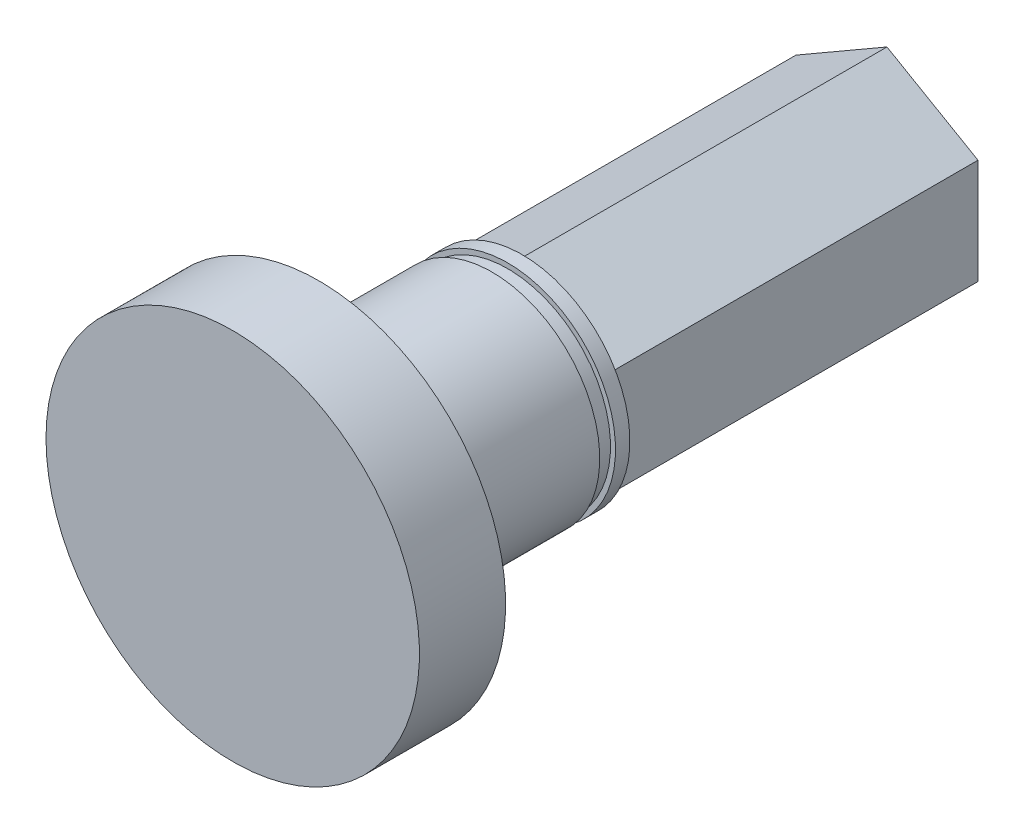
ISO-10303-21;
HEADER;
FILE_DESCRIPTION(('STEP AP214'),'2;1');
FILE_NAME('part.step','',(''),(''),'','','');
FILE_SCHEMA(('AUTOMOTIVE_DESIGN { 1 0 10303 214 1 1 1 1 }'));
ENDSEC;
DATA;
#1=APPLICATION_CONTEXT('core data for automotive mechanical design processes');
#2=APPLICATION_PROTOCOL_DEFINITION('international standard','automotive_design',2000,#1);
#3=PRODUCT_CONTEXT('',#1,'mechanical');
#4=PRODUCT('Part','Part','',(#3));
#5=PRODUCT_RELATED_PRODUCT_CATEGORY('part','',(#4));
#6=PRODUCT_DEFINITION_FORMATION('','',#4);
#7=PRODUCT_DEFINITION_CONTEXT('part definition',#1,'design');
#8=PRODUCT_DEFINITION('design','',#6,#7);
#9=PRODUCT_DEFINITION_SHAPE('','',#8);
#10=(LENGTH_UNIT() NAMED_UNIT(*) SI_UNIT(.MILLI.,.METRE.));
#11=(NAMED_UNIT(*) PLANE_ANGLE_UNIT() SI_UNIT($,.RADIAN.));
#12=(NAMED_UNIT(*) SI_UNIT($,.STERADIAN.) SOLID_ANGLE_UNIT());
#13=UNCERTAINTY_MEASURE_WITH_UNIT(LENGTH_MEASURE(1.E-05),#10,'distance_accuracy_value','');
#14=(GEOMETRIC_REPRESENTATION_CONTEXT(3) GLOBAL_UNCERTAINTY_ASSIGNED_CONTEXT((#13)) GLOBAL_UNIT_ASSIGNED_CONTEXT((#10,
#11,#12)) REPRESENTATION_CONTEXT('',''));
#15=CARTESIAN_POINT('',(0.,0.,0.));
#16=DIRECTION('',(0.,0.,1.));
#17=DIRECTION('',(1.,0.,0.));
#18=AXIS2_PLACEMENT_3D('',#15,#16,#17);
#19=CARTESIAN_POINT('',(0.,0.,16.6624000000866));
#20=DIRECTION('',(0.,0.,-1.));
#21=DIRECTION('',(-1.,0.,0.));
#22=AXIS2_PLACEMENT_3D('',#19,#20,#21);
#23=CONICAL_SURFACE('',#22,2.0192999998585,1.0297442585643);
#24=CARTESIAN_POINT('',(-1.13686837721616E-10,0.,17.8757178480282));
#25=VERTEX_POINT('',#24);
#26=VERTEX_LOOP('',#25);
#27=FACE_BOUND('',#26,.T.);
#28=CARTESIAN_POINT('',(0.,0.,16.6624));
#29=DIRECTION('',(0.,0.,-1.));
#30=DIRECTION('',(-1.,0.,0.));
#31=AXIS2_PLACEMENT_3D('',#28,#29,#30);
#32=CIRCLE('',#31,2.01929999999999);
#33=CARTESIAN_POINT('',(-2.01929999999999,0.,16.6624));
#34=VERTEX_POINT('',#33);
#35=EDGE_CURVE('E78',#34,#34,#32,.T.);
#36=ORIENTED_EDGE('',*,*,#35,.T.);
#37=EDGE_LOOP('',(#36));
#38=FACE_BOUND('',#37,.T.);
#39=ADVANCED_FACE('F16',(#27,#38),#23,.F.);
#40=CARTESIAN_POINT('',(0.,0.,0.));
#41=DIRECTION('',(0.,0.,-1.));
#42=DIRECTION('',(-1.,0.,0.));
#43=AXIS2_PLACEMENT_3D('',#40,#41,#42);
#44=CYLINDRICAL_SURFACE('',#43,2.01929999999999);
#45=ORIENTED_EDGE('',*,*,#35,.F.);
#46=EDGE_LOOP('',(#45));
#47=FACE_BOUND('',#46,.T.);
#48=CARTESIAN_POINT('',(0.,0.,0.));
#49=DIRECTION('',(0.,0.,-1.));
#50=DIRECTION('',(-1.,0.,0.));
#51=AXIS2_PLACEMENT_3D('',#48,#49,#50);
#52=CIRCLE('',#51,2.01929999999999);
#53=CARTESIAN_POINT('',(-2.01929999999999,0.,0.));
#54=VERTEX_POINT('',#53);
#55=EDGE_CURVE('E19',#54,#54,#52,.T.);
#56=ORIENTED_EDGE('',*,*,#55,.T.);
#57=EDGE_LOOP('',(#56));
#58=FACE_BOUND('',#57,.T.);
#59=ADVANCED_FACE('F75',(#47,#58),#44,.F.);
#60=CARTESIAN_POINT('',(0.,0.,0.));
#61=DIRECTION('',(0.,0.,1.));
#62=DIRECTION('',(1.,0.,0.));
#63=AXIS2_PLACEMENT_3D('',#60,#61,#62);
#64=PLANE('',#63);
#65=DIRECTION('',(-0.866025403784439,-0.5,0.));
#66=VECTOR('',#65,1.);
#67=CARTESIAN_POINT('',(0.,-7.31768372187083,0.));
#68=LINE('',#67,#66);
#69=CARTESIAN_POINT('',(6.3373,-3.65884186093542,0.));
#70=VERTEX_POINT('',#69);
#71=CARTESIAN_POINT('',(0.,-7.31768372187083,0.));
#72=VERTEX_POINT('',#71);
#73=EDGE_CURVE('E134',#70,#72,#68,.T.);
#74=ORIENTED_EDGE('',*,*,#73,.T.);
#75=DIRECTION('',(-0.866025403784439,0.5,0.));
#76=VECTOR('',#75,1.);
#77=CARTESIAN_POINT('',(-6.3373,-3.65884186093542,0.));
#78=LINE('',#77,#76);
#79=CARTESIAN_POINT('',(-6.3373,-3.65884186093542,0.));
#80=VERTEX_POINT('',#79);
#81=EDGE_CURVE('E69',#72,#80,#78,.T.);
#82=ORIENTED_EDGE('',*,*,#81,.T.);
#83=DIRECTION('',(0.,1.,0.));
#84=VECTOR('',#83,1.);
#85=CARTESIAN_POINT('',(-6.3373,3.65884186093542,0.));
#86=LINE('',#85,#84);
#87=CARTESIAN_POINT('',(-6.3373,3.65884186093541,0.));
#88=VERTEX_POINT('',#87);
#89=EDGE_CURVE('E155',#80,#88,#86,.T.);
#90=ORIENTED_EDGE('',*,*,#89,.T.);
#91=DIRECTION('',(0.866025403784439,0.5,0.));
#92=VECTOR('',#91,1.);
#93=CARTESIAN_POINT('',(0.,7.31768372187083,0.));
#94=LINE('',#93,#92);
#95=CARTESIAN_POINT('',(0.,7.31768372187083,0.));
#96=VERTEX_POINT('',#95);
#97=EDGE_CURVE('E150',#88,#96,#94,.T.);
#98=ORIENTED_EDGE('',*,*,#97,.T.);
#99=DIRECTION('',(0.866025403784439,-0.5,0.));
#100=VECTOR('',#99,1.);
#101=CARTESIAN_POINT('',(6.3373,3.65884186093542,0.));
#102=LINE('',#101,#100);
#103=CARTESIAN_POINT('',(6.3373,3.65884186093542,0.));
#104=VERTEX_POINT('',#103);
#105=EDGE_CURVE('E145',#96,#104,#102,.T.);
#106=ORIENTED_EDGE('',*,*,#105,.T.);
#107=DIRECTION('',(0.,1.,0.));
#108=VECTOR('',#107,1.);
#109=CARTESIAN_POINT('',(6.3373,-3.65884186093542,0.));
#110=LINE('',#109,#108);
#111=EDGE_CURVE('E140',#104,#70,#110,.F.);
#112=ORIENTED_EDGE('',*,*,#111,.T.);
#113=EDGE_LOOP('',(#74,#82,#90,#98,#106,#112));
#114=FACE_BOUND('',#113,.T.);
#115=ORIENTED_EDGE('',*,*,#55,.F.);
#116=EDGE_LOOP('',(#115));
#117=FACE_BOUND('',#116,.T.);
#118=ADVANCED_FACE('F166',(#114,#117),#64,.F.);
#119=CARTESIAN_POINT('',(-6.3373,-3.65884186093542,25.4));
#120=DIRECTION('',(0.5,0.866025403784439,0.));
#121=DIRECTION('',(-0.866025403784439,0.5,0.));
#122=AXIS2_PLACEMENT_3D('',#119,#120,#121);
#123=PLANE('',#122);
#124=DIRECTION('',(0.,0.,1.));
#125=VECTOR('',#124,1.);
#126=CARTESIAN_POINT('',(0.,-7.31768372187083,25.4));
#127=LINE('',#126,#125);
#128=CARTESIAN_POINT('',(0.,-7.31768372187083,25.4));
#129=VERTEX_POINT('',#128);
#130=EDGE_CURVE('E138',#72,#129,#127,.T.);
#131=ORIENTED_EDGE('',*,*,#130,.T.);
#132=DIRECTION('',(-0.866025403784439,0.5,0.));
#133=VECTOR('',#132,1.);
#134=CARTESIAN_POINT('',(0.,-7.31768372187083,25.4));
#135=LINE('',#134,#133);
#136=CARTESIAN_POINT('',(-6.3373,-3.65884186093542,25.4));
#137=VERTEX_POINT('',#136);
#138=EDGE_CURVE('E132',#129,#137,#135,.T.);
#139=ORIENTED_EDGE('',*,*,#138,.T.);
#140=DIRECTION('',(0.,0.,1.));
#141=VECTOR('',#140,1.);
#142=CARTESIAN_POINT('',(-6.3373,-3.65884186093542,25.4));
#143=LINE('',#142,#141);
#144=EDGE_CURVE('E156',#137,#80,#143,.F.);
#145=ORIENTED_EDGE('',*,*,#144,.T.);
#146=ORIENTED_EDGE('',*,*,#81,.F.);
#147=EDGE_LOOP('',(#131,#139,#145,#146));
#148=FACE_BOUND('',#147,.T.);
#149=ADVANCED_FACE('F160',(#148),#123,.F.);
#150=CARTESIAN_POINT('',(-6.3373,3.65884186093542,25.4));
#151=DIRECTION('',(1.,0.,0.));
#152=DIRECTION('',(0.,1.,0.));
#153=AXIS2_PLACEMENT_3D('',#150,#151,#152);
#154=PLANE('',#153);
#155=ORIENTED_EDGE('',*,*,#144,.F.);
#156=DIRECTION('',(0.,1.,0.));
#157=VECTOR('',#156,1.);
#158=CARTESIAN_POINT('',(-6.3373,0.,25.4));
#159=LINE('',#158,#157);
#160=CARTESIAN_POINT('',(-6.3373,3.65884186093542,25.4));
#161=VERTEX_POINT('',#160);
#162=EDGE_CURVE('E130',#137,#161,#159,.T.);
#163=ORIENTED_EDGE('',*,*,#162,.T.);
#164=DIRECTION('',(0.,0.,1.));
#165=VECTOR('',#164,1.);
#166=CARTESIAN_POINT('',(-6.3373,3.65884186093541,25.4));
#167=LINE('',#166,#165);
#168=EDGE_CURVE('E152',#161,#88,#167,.F.);
#169=ORIENTED_EDGE('',*,*,#168,.T.);
#170=ORIENTED_EDGE('',*,*,#89,.F.);
#171=EDGE_LOOP('',(#155,#163,#169,#170));
#172=FACE_BOUND('',#171,.T.);
#173=ADVANCED_FACE('F163',(#172),#154,.F.);
#174=CARTESIAN_POINT('',(0.,7.31768372187083,25.4));
#175=DIRECTION('',(0.5,-0.866025403784439,0.));
#176=DIRECTION('',(0.866025403784439,0.5,0.));
#177=AXIS2_PLACEMENT_3D('',#174,#175,#176);
#178=PLANE('',#177);
#179=ORIENTED_EDGE('',*,*,#168,.F.);
#180=DIRECTION('',(0.866025403784438,0.5,0.));
#181=VECTOR('',#180,1.);
#182=CARTESIAN_POINT('',(-6.3373,3.65884186093542,25.4));
#183=LINE('',#182,#181);
#184=CARTESIAN_POINT('',(0.,7.31768372187083,25.4));
#185=VERTEX_POINT('',#184);
#186=EDGE_CURVE('E128',#161,#185,#183,.T.);
#187=ORIENTED_EDGE('',*,*,#186,.T.);
#188=DIRECTION('',(0.,0.,1.));
#189=VECTOR('',#188,1.);
#190=CARTESIAN_POINT('',(0.,7.31768372187083,25.4));
#191=LINE('',#190,#189);
#192=EDGE_CURVE('E147',#185,#96,#191,.F.);
#193=ORIENTED_EDGE('',*,*,#192,.T.);
#194=ORIENTED_EDGE('',*,*,#97,.F.);
#195=EDGE_LOOP('',(#179,#187,#193,#194));
#196=FACE_BOUND('',#195,.T.);
#197=ADVANCED_FACE('F171',(#196),#178,.F.);
#198=CARTESIAN_POINT('',(6.3373,3.65884186093542,25.4));
#199=DIRECTION('',(-0.5,-0.866025403784439,0.));
#200=DIRECTION('',(0.866025403784439,-0.5,0.));
#201=AXIS2_PLACEMENT_3D('',#198,#199,#200);
#202=PLANE('',#201);
#203=ORIENTED_EDGE('',*,*,#192,.F.);
#204=DIRECTION('',(0.866025403784438,-0.5,0.));
#205=VECTOR('',#204,1.);
#206=CARTESIAN_POINT('',(0.,7.31768372187083,25.4));
#207=LINE('',#206,#205);
#208=CARTESIAN_POINT('',(6.3373,3.65884186093542,25.4));
#209=VERTEX_POINT('',#208);
#210=EDGE_CURVE('E124',#185,#209,#207,.T.);
#211=ORIENTED_EDGE('',*,*,#210,.T.);
#212=DIRECTION('',(0.,0.,1.));
#213=VECTOR('',#212,1.);
#214=CARTESIAN_POINT('',(6.3373,3.65884186093542,25.4));
#215=LINE('',#214,#213);
#216=EDGE_CURVE('E142',#209,#104,#215,.F.);
#217=ORIENTED_EDGE('',*,*,#216,.T.);
#218=ORIENTED_EDGE('',*,*,#105,.F.);
#219=EDGE_LOOP('',(#203,#211,#217,#218));
#220=FACE_BOUND('',#219,.T.);
#221=ADVANCED_FACE('F175',(#220),#202,.F.);
#222=CARTESIAN_POINT('',(6.3373,-3.65884186093542,25.4));
#223=DIRECTION('',(-1.,0.,0.));
#224=DIRECTION('',(0.,0.,1.));
#225=AXIS2_PLACEMENT_3D('',#222,#223,#224);
#226=PLANE('',#225);
#227=ORIENTED_EDGE('',*,*,#216,.F.);
#228=DIRECTION('',(0.,1.,0.));
#229=VECTOR('',#228,1.);
#230=CARTESIAN_POINT('',(6.3373,0.,25.4));
#231=LINE('',#230,#229);
#232=CARTESIAN_POINT('',(6.3373,-3.65884186093542,25.4));
#233=VERTEX_POINT('',#232);
#234=EDGE_CURVE('E34',#209,#233,#231,.F.);
#235=ORIENTED_EDGE('',*,*,#234,.T.);
#236=DIRECTION('',(0.,0.,1.));
#237=VECTOR('',#236,1.);
#238=CARTESIAN_POINT('',(6.3373,-3.65884186093542,25.4));
#239=LINE('',#238,#237);
#240=EDGE_CURVE('E136',#233,#70,#239,.F.);
#241=ORIENTED_EDGE('',*,*,#240,.T.);
#242=ORIENTED_EDGE('',*,*,#111,.F.);
#243=EDGE_LOOP('',(#227,#235,#241,#242));
#244=FACE_BOUND('',#243,.T.);
#245=ADVANCED_FACE('F177',(#244),#226,.F.);
#246=CARTESIAN_POINT('',(0.,-7.31768372187083,25.4));
#247=DIRECTION('',(-0.5,0.866025403784439,0.));
#248=DIRECTION('',(-0.866025403784439,-0.5,0.));
#249=AXIS2_PLACEMENT_3D('',#246,#247,#248);
#250=PLANE('',#249);
#251=ORIENTED_EDGE('',*,*,#240,.F.);
#252=DIRECTION('',(-0.866025403784439,-0.5,0.));
#253=VECTOR('',#252,1.);
#254=CARTESIAN_POINT('',(6.3373,-3.65884186093542,25.4));
#255=LINE('',#254,#253);
#256=EDGE_CURVE('E115',#233,#129,#255,.T.);
#257=ORIENTED_EDGE('',*,*,#256,.T.);
#258=ORIENTED_EDGE('',*,*,#130,.F.);
#259=ORIENTED_EDGE('',*,*,#73,.F.);
#260=EDGE_LOOP('',(#251,#257,#258,#259));
#261=FACE_BOUND('',#260,.T.);
#262=ADVANCED_FACE('F179',(#261),#250,.F.);
#263=CARTESIAN_POINT('',(0.,0.,25.4));
#264=DIRECTION('',(0.,0.,1.));
#265=DIRECTION('',(1.,0.,0.));
#266=AXIS2_PLACEMENT_3D('',#263,#264,#265);
#267=PLANE('',#266);
#268=ORIENTED_EDGE('',*,*,#234,.F.);
#269=ORIENTED_EDGE('',*,*,#210,.F.);
#270=ORIENTED_EDGE('',*,*,#186,.F.);
#271=ORIENTED_EDGE('',*,*,#162,.F.);
#272=ORIENTED_EDGE('',*,*,#138,.F.);
#273=ORIENTED_EDGE('',*,*,#256,.F.);
#274=EDGE_LOOP('',(#268,#269,#270,#271,#272,#273));
#275=FACE_BOUND('',#274,.T.);
#276=CARTESIAN_POINT('',(0.,0.,25.4));
#277=DIRECTION('',(0.,0.,-1.));
#278=DIRECTION('',(-1.,0.,0.));
#279=AXIS2_PLACEMENT_3D('',#276,#277,#278);
#280=CIRCLE('',#279,7.5);
#281=CARTESIAN_POINT('',(-7.5,0.,25.4));
#282=VERTEX_POINT('',#281);
#283=EDGE_CURVE('E113',#282,#282,#280,.F.);
#284=ORIENTED_EDGE('',*,*,#283,.F.);
#285=EDGE_LOOP('',(#284));
#286=FACE_BOUND('',#285,.T.);
#287=ADVANCED_FACE('F181',(#275,#286),#267,.F.);
#288=CARTESIAN_POINT('',(0.,0.,26.4));
#289=DIRECTION('',(0.,0.,-1.));
#290=DIRECTION('',(-1.,0.,0.));
#291=AXIS2_PLACEMENT_3D('',#288,#289,#290);
#292=CYLINDRICAL_SURFACE('',#291,7.5);
#293=ORIENTED_EDGE('',*,*,#283,.T.);
#294=EDGE_LOOP('',(#293));
#295=FACE_BOUND('',#294,.T.);
#296=CARTESIAN_POINT('',(0.,0.,26.4));
#297=DIRECTION('',(0.,0.,-1.));
#298=DIRECTION('',(-1.,0.,0.));
#299=AXIS2_PLACEMENT_3D('',#296,#297,#298);
#300=CIRCLE('',#299,7.5);
#301=CARTESIAN_POINT('',(-7.5,0.,26.4));
#302=VERTEX_POINT('',#301);
#303=EDGE_CURVE('E111',#302,#302,#300,.F.);
#304=ORIENTED_EDGE('',*,*,#303,.F.);
#305=EDGE_LOOP('',(#304));
#306=FACE_BOUND('',#305,.T.);
#307=ADVANCED_FACE('F188',(#295,#306),#292,.T.);
#308=CARTESIAN_POINT('',(0.,0.,26.4));
#309=DIRECTION('',(0.,0.,1.));
#310=DIRECTION('',(1.,0.,0.));
#311=AXIS2_PLACEMENT_3D('',#308,#309,#310);
#312=PLANE('',#311);
#313=ORIENTED_EDGE('',*,*,#303,.T.);
#314=EDGE_LOOP('',(#313));
#315=FACE_BOUND('',#314,.T.);
#316=CARTESIAN_POINT('',(0.,0.,26.4));
#317=DIRECTION('',(0.,0.,-1.));
#318=DIRECTION('',(-1.,0.,0.));
#319=AXIS2_PLACEMENT_3D('',#316,#317,#318);
#320=CIRCLE('',#319,7.15);
#321=CARTESIAN_POINT('',(-7.15,0.,26.4));
#322=VERTEX_POINT('',#321);
#323=EDGE_CURVE('E108',#322,#322,#320,.F.);
#324=ORIENTED_EDGE('',*,*,#323,.F.);
#325=EDGE_LOOP('',(#324));
#326=FACE_BOUND('',#325,.T.);
#327=ADVANCED_FACE('F234',(#315,#326),#312,.T.);
#328=CARTESIAN_POINT('',(0.,0.,27.5));
#329=DIRECTION('',(0.,0.,-1.));
#330=DIRECTION('',(-1.,0.,0.));
#331=AXIS2_PLACEMENT_3D('',#328,#329,#330);
#332=CYLINDRICAL_SURFACE('',#331,7.15);
#333=CARTESIAN_POINT('',(0.,0.,27.5));
#334=DIRECTION('',(0.,0.,-1.));
#335=DIRECTION('',(-1.,0.,0.));
#336=AXIS2_PLACEMENT_3D('',#333,#334,#335);
#337=CIRCLE('',#336,7.15);
#338=CARTESIAN_POINT('',(-7.15,0.,27.5));
#339=VERTEX_POINT('',#338);
#340=EDGE_CURVE('E105',#339,#339,#337,.T.);
#341=ORIENTED_EDGE('',*,*,#340,.T.);
#342=EDGE_LOOP('',(#341));
#343=FACE_BOUND('',#342,.T.);
#344=ORIENTED_EDGE('',*,*,#323,.T.);
#345=EDGE_LOOP('',(#344));
#346=FACE_BOUND('',#345,.T.);
#347=ADVANCED_FACE('F230',(#343,#346),#332,.T.);
#348=CARTESIAN_POINT('',(0.,0.,27.5));
#349=DIRECTION('',(0.,0.,1.));
#350=DIRECTION('',(1.,0.,0.));
#351=AXIS2_PLACEMENT_3D('',#348,#349,#350);
#352=PLANE('',#351);
#353=CARTESIAN_POINT('',(0.,0.,27.5));
#354=DIRECTION('',(0.,0.,-1.));
#355=DIRECTION('',(-1.,0.,0.));
#356=AXIS2_PLACEMENT_3D('',#353,#354,#355);
#357=CIRCLE('',#356,7.5);
#358=CARTESIAN_POINT('',(-7.5,0.,27.5));
#359=VERTEX_POINT('',#358);
#360=EDGE_CURVE('E102',#359,#359,#357,.F.);
#361=ORIENTED_EDGE('',*,*,#360,.F.);
#362=EDGE_LOOP('',(#361));
#363=FACE_BOUND('',#362,.T.);
#364=ORIENTED_EDGE('',*,*,#340,.F.);
#365=EDGE_LOOP('',(#364));
#366=FACE_BOUND('',#365,.T.);
#367=ADVANCED_FACE('F226',(#363,#366),#352,.F.);
#368=CARTESIAN_POINT('',(0.,0.,38.549));
#369=DIRECTION('',(0.,0.,-1.));
#370=DIRECTION('',(-1.,0.,0.));
#371=AXIS2_PLACEMENT_3D('',#368,#369,#370);
#372=CYLINDRICAL_SURFACE('',#371,7.5);
#373=ORIENTED_EDGE('',*,*,#360,.T.);
#374=EDGE_LOOP('',(#373));
#375=FACE_BOUND('',#374,.T.);
#376=CARTESIAN_POINT('',(0.,0.,38.549));
#377=DIRECTION('',(0.,0.,-1.));
#378=DIRECTION('',(-1.,0.,0.));
#379=AXIS2_PLACEMENT_3D('',#376,#377,#378);
#380=CIRCLE('',#379,7.5);
#381=CARTESIAN_POINT('',(-7.5,0.,38.549));
#382=VERTEX_POINT('',#381);
#383=EDGE_CURVE('E99',#382,#382,#380,.F.);
#384=ORIENTED_EDGE('',*,*,#383,.F.);
#385=EDGE_LOOP('',(#384));
#386=FACE_BOUND('',#385,.T.);
#387=ADVANCED_FACE('F222',(#375,#386),#372,.T.);
#388=CARTESIAN_POINT('',(0.,0.,38.549));
#389=DIRECTION('',(0.,0.,1.));
#390=DIRECTION('',(1.,0.,0.));
#391=AXIS2_PLACEMENT_3D('',#388,#389,#390);
#392=PLANE('',#391);
#393=ORIENTED_EDGE('',*,*,#383,.T.);
#394=EDGE_LOOP('',(#393));
#395=FACE_BOUND('',#394,.T.);
#396=CARTESIAN_POINT('',(0.,0.,38.549));
#397=DIRECTION('',(0.,0.,-1.));
#398=DIRECTION('',(-1.,0.,0.));
#399=AXIS2_PLACEMENT_3D('',#396,#397,#398);
#400=CIRCLE('',#399,7.15);
#401=CARTESIAN_POINT('',(-7.15,0.,38.549));
#402=VERTEX_POINT('',#401);
#403=EDGE_CURVE('E96',#402,#402,#400,.F.);
#404=ORIENTED_EDGE('',*,*,#403,.F.);
#405=EDGE_LOOP('',(#404));
#406=FACE_BOUND('',#405,.T.);
#407=ADVANCED_FACE('F218',(#395,#406),#392,.T.);
#408=CARTESIAN_POINT('',(0.,0.,39.299));
#409=DIRECTION('',(0.,0.,-1.));
#410=DIRECTION('',(-1.,0.,0.));
#411=AXIS2_PLACEMENT_3D('',#408,#409,#410);
#412=CYLINDRICAL_SURFACE('',#411,7.15);
#413=CARTESIAN_POINT('',(0.,0.,39.299));
#414=DIRECTION('',(0.,0.,-1.));
#415=DIRECTION('',(-1.,0.,0.));
#416=AXIS2_PLACEMENT_3D('',#413,#414,#415);
#417=CIRCLE('',#416,7.15);
#418=CARTESIAN_POINT('',(-7.15,0.,39.299));
#419=VERTEX_POINT('',#418);
#420=EDGE_CURVE('E93',#419,#419,#417,.T.);
#421=ORIENTED_EDGE('',*,*,#420,.T.);
#422=EDGE_LOOP('',(#421));
#423=FACE_BOUND('',#422,.T.);
#424=ORIENTED_EDGE('',*,*,#403,.T.);
#425=EDGE_LOOP('',(#424));
#426=FACE_BOUND('',#425,.T.);
#427=ADVANCED_FACE('F214',(#423,#426),#412,.T.);
#428=CARTESIAN_POINT('',(0.,0.,39.299));
#429=DIRECTION('',(0.,0.,1.));
#430=DIRECTION('',(1.,0.,0.));
#431=AXIS2_PLACEMENT_3D('',#428,#429,#430);
#432=PLANE('',#431);
#433=CARTESIAN_POINT('',(0.,0.,39.299));
#434=DIRECTION('',(0.,0.,-1.));
#435=DIRECTION('',(-1.,0.,0.));
#436=AXIS2_PLACEMENT_3D('',#433,#434,#435);
#437=CIRCLE('',#436,9.525);
#438=CARTESIAN_POINT('',(-9.525,0.,39.299));
#439=VERTEX_POINT('',#438);
#440=EDGE_CURVE('E90',#439,#439,#437,.F.);
#441=ORIENTED_EDGE('',*,*,#440,.F.);
#442=EDGE_LOOP('',(#441));
#443=FACE_BOUND('',#442,.T.);
#444=ORIENTED_EDGE('',*,*,#420,.F.);
#445=EDGE_LOOP('',(#444));
#446=FACE_BOUND('',#445,.T.);
#447=ADVANCED_FACE('F210',(#443,#446),#432,.F.);
#448=CARTESIAN_POINT('',(0.,0.,39.553));
#449=DIRECTION('',(0.,0.,-1.));
#450=DIRECTION('',(-1.,0.,0.));
#451=AXIS2_PLACEMENT_3D('',#448,#449,#450);
#452=CYLINDRICAL_SURFACE('',#451,9.525);
#453=CARTESIAN_POINT('',(0.,0.,39.553));
#454=DIRECTION('',(0.,0.,-1.));
#455=DIRECTION('',(-1.,0.,0.));
#456=AXIS2_PLACEMENT_3D('',#453,#454,#455);
#457=CIRCLE('',#456,9.525);
#458=CARTESIAN_POINT('',(-9.525,0.,39.553));
#459=VERTEX_POINT('',#458);
#460=EDGE_CURVE('E87',#459,#459,#457,.T.);
#461=ORIENTED_EDGE('',*,*,#460,.T.);
#462=EDGE_LOOP('',(#461));
#463=FACE_BOUND('',#462,.T.);
#464=ORIENTED_EDGE('',*,*,#440,.T.);
#465=EDGE_LOOP('',(#464));
#466=FACE_BOUND('',#465,.T.);
#467=ADVANCED_FACE('F206',(#463,#466),#452,.T.);
#468=CARTESIAN_POINT('',(0.,0.,39.553));
#469=DIRECTION('',(0.,0.,1.));
#470=DIRECTION('',(1.,0.,0.));
#471=AXIS2_PLACEMENT_3D('',#468,#469,#470);
#472=PLANE('',#471);
#473=CARTESIAN_POINT('',(0.,0.,39.553));
#474=DIRECTION('',(0.,0.,-1.));
#475=DIRECTION('',(-1.,0.,0.));
#476=AXIS2_PLACEMENT_3D('',#473,#474,#475);
#477=CIRCLE('',#476,13.);
#478=CARTESIAN_POINT('',(-13.,0.,39.553));
#479=VERTEX_POINT('',#478);
#480=EDGE_CURVE('E25',#479,#479,#477,.F.);
#481=ORIENTED_EDGE('',*,*,#480,.F.);
#482=EDGE_LOOP('',(#481));
#483=FACE_BOUND('',#482,.T.);
#484=ORIENTED_EDGE('',*,*,#460,.F.);
#485=EDGE_LOOP('',(#484));
#486=FACE_BOUND('',#485,.T.);
#487=ADVANCED_FACE('F200',(#483,#486),#472,.F.);
#488=CARTESIAN_POINT('',(0.,0.,45.553));
#489=DIRECTION('',(0.,0.,-1.));
#490=DIRECTION('',(-1.,0.,0.));
#491=AXIS2_PLACEMENT_3D('',#488,#489,#490);
#492=CYLINDRICAL_SURFACE('',#491,13.);
#493=ORIENTED_EDGE('',*,*,#480,.T.);
#494=EDGE_LOOP('',(#493));
#495=FACE_BOUND('',#494,.T.);
#496=CARTESIAN_POINT('',(0.,0.,45.553));
#497=DIRECTION('',(0.,0.,-1.));
#498=DIRECTION('',(-1.,0.,0.));
#499=AXIS2_PLACEMENT_3D('',#496,#497,#498);
#500=CIRCLE('',#499,13.);
#501=CARTESIAN_POINT('',(-13.,0.,45.553));
#502=VERTEX_POINT('',#501);
#503=EDGE_CURVE('E11',#502,#502,#500,.F.);
#504=ORIENTED_EDGE('',*,*,#503,.F.);
#505=EDGE_LOOP('',(#504));
#506=FACE_BOUND('',#505,.T.);
#507=ADVANCED_FACE('F194',(#495,#506),#492,.T.);
#508=CARTESIAN_POINT('',(0.,0.,45.553));
#509=DIRECTION('',(0.,0.,1.));
#510=DIRECTION('',(1.,0.,0.));
#511=AXIS2_PLACEMENT_3D('',#508,#509,#510);
#512=PLANE('',#511);
#513=ORIENTED_EDGE('',*,*,#503,.T.);
#514=EDGE_LOOP('',(#513));
#515=FACE_BOUND('',#514,.T.);
#516=ADVANCED_FACE('F192',(#515),#512,.T.);
#517=CLOSED_SHELL('',(#39,#59,#118,#149,#173,#197,#221,#245,#262,#287,#307,#327,#347,#367,#387,
#407,#427,#447,#467,#487,#507,#516));
#518=MANIFOLD_SOLID_BREP('B1',#517);
#519=ADVANCED_BREP_SHAPE_REPRESENTATION('',(#18,#518),#14);
#520=SHAPE_DEFINITION_REPRESENTATION(#9,#519);
ENDSEC;
END-ISO-10303-21;
